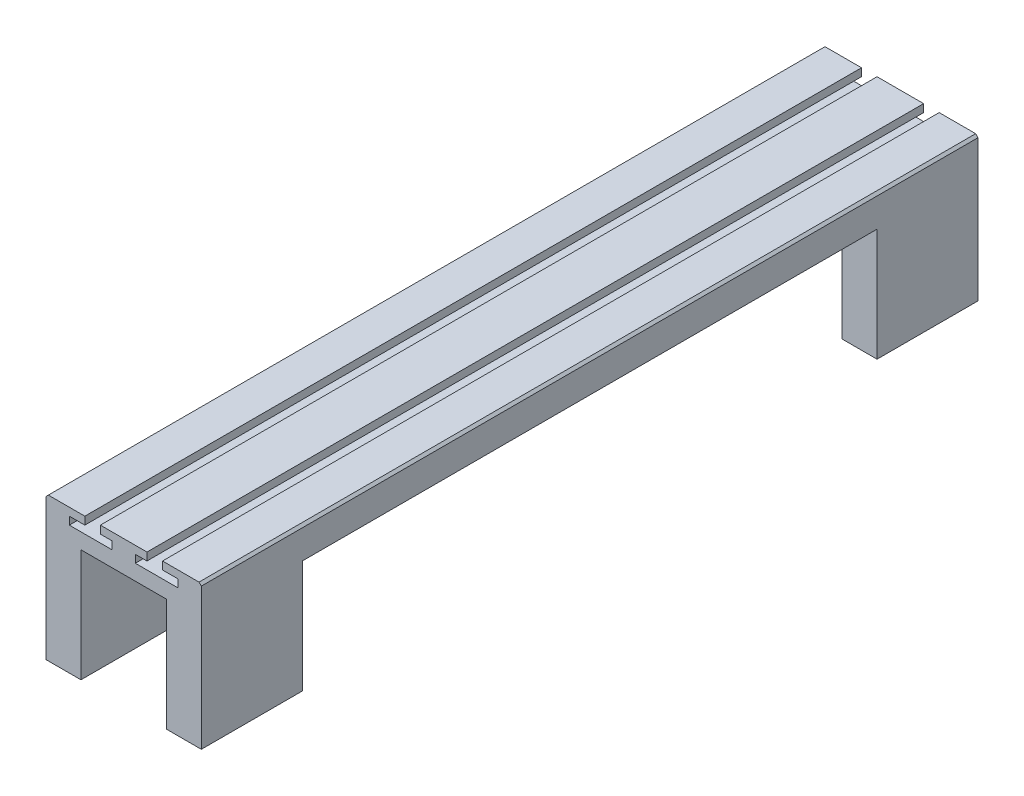
ISO-10303-21;
HEADER;
FILE_DESCRIPTION(('STEP AP214'),'2;1');
FILE_NAME('part.step','',(''),(''),'','','');
FILE_SCHEMA(('AUTOMOTIVE_DESIGN { 1 0 10303 214 1 1 1 1 }'));
ENDSEC;
DATA;
#1=APPLICATION_CONTEXT('core data for automotive mechanical design processes');
#2=APPLICATION_PROTOCOL_DEFINITION('international standard','automotive_design',2000,#1);
#3=PRODUCT_CONTEXT('',#1,'mechanical');
#4=PRODUCT('Part','Part','',(#3));
#5=PRODUCT_RELATED_PRODUCT_CATEGORY('part','',(#4));
#6=PRODUCT_DEFINITION_FORMATION('','',#4);
#7=PRODUCT_DEFINITION_CONTEXT('part definition',#1,'design');
#8=PRODUCT_DEFINITION('design','',#6,#7);
#9=PRODUCT_DEFINITION_SHAPE('','',#8);
#10=(LENGTH_UNIT() NAMED_UNIT(*) SI_UNIT(.MILLI.,.METRE.));
#11=(NAMED_UNIT(*) PLANE_ANGLE_UNIT() SI_UNIT($,.RADIAN.));
#12=(NAMED_UNIT(*) SI_UNIT($,.STERADIAN.) SOLID_ANGLE_UNIT());
#13=UNCERTAINTY_MEASURE_WITH_UNIT(LENGTH_MEASURE(1.E-05),#10,'distance_accuracy_value','');
#14=(GEOMETRIC_REPRESENTATION_CONTEXT(3) GLOBAL_UNCERTAINTY_ASSIGNED_CONTEXT((#13)) GLOBAL_UNIT_ASSIGNED_CONTEXT((#10,
#11,#12)) REPRESENTATION_CONTEXT('',''));
#15=CARTESIAN_POINT('',(0.,0.,0.));
#16=DIRECTION('',(0.,0.,1.));
#17=DIRECTION('',(1.,0.,0.));
#18=AXIS2_PLACEMENT_3D('',#15,#16,#17);
#19=CARTESIAN_POINT('',(-50.,-40.,1000.));
#20=DIRECTION('',(0.,1.,0.));
#21=DIRECTION('',(-1.,0.,0.));
#22=AXIS2_PLACEMENT_3D('',#19,#20,#21);
#23=PLANE('',#22);
#24=DIRECTION('',(-1.,0.,0.));
#25=VECTOR('',#24,1.);
#26=CARTESIAN_POINT('',(-50.,-40.,130.));
#27=LINE('',#26,#25);
#28=CARTESIAN_POINT('',(-4.99999999999998,-40.,130.));
#29=VERTEX_POINT('',#28);
#30=CARTESIAN_POINT('',(-50.,-40.,130.));
#31=VERTEX_POINT('',#30);
#32=EDGE_CURVE('E360',#29,#31,#27,.T.);
#33=ORIENTED_EDGE('',*,*,#32,.F.);
#34=DIRECTION('',(0.,0.,1.));
#35=VECTOR('',#34,1.);
#36=CARTESIAN_POINT('',(-5.,-40.,0.));
#37=LINE('',#36,#35);
#38=CARTESIAN_POINT('',(-4.99999999999998,-40.,0.));
#39=VERTEX_POINT('',#38);
#40=EDGE_CURVE('E318',#39,#29,#37,.T.);
#41=ORIENTED_EDGE('',*,*,#40,.F.);
#42=DIRECTION('',(1.,0.,0.));
#43=VECTOR('',#42,1.);
#44=CARTESIAN_POINT('',(-50.,-40.,0.));
#45=LINE('',#44,#43);
#46=CARTESIAN_POINT('',(105.,-40.,0.));
#47=VERTEX_POINT('',#46);
#48=EDGE_CURVE('E482',#39,#47,#45,.T.);
#49=ORIENTED_EDGE('',*,*,#48,.T.);
#50=DIRECTION('',(0.,0.,-1.));
#51=VECTOR('',#50,1.);
#52=CARTESIAN_POINT('',(105.,-40.,0.));
#53=LINE('',#52,#51);
#54=CARTESIAN_POINT('',(105.,-40.,130.));
#55=VERTEX_POINT('',#54);
#56=EDGE_CURVE('E327',#55,#47,#53,.T.);
#57=ORIENTED_EDGE('',*,*,#56,.F.);
#58=DIRECTION('',(-1.,0.,0.));
#59=VECTOR('',#58,1.);
#60=CARTESIAN_POINT('',(150.,-40.,130.));
#61=LINE('',#60,#59);
#62=CARTESIAN_POINT('',(150.,-40.,130.));
#63=VERTEX_POINT('',#62);
#64=EDGE_CURVE('E299',#63,#55,#61,.T.);
#65=ORIENTED_EDGE('',*,*,#64,.F.);
#66=DIRECTION('',(0.,0.,-1.));
#67=VECTOR('',#66,1.);
#68=CARTESIAN_POINT('',(150.,-40.,1000.));
#69=LINE('',#68,#67);
#70=CARTESIAN_POINT('',(150.,-40.,870.));
#71=VERTEX_POINT('',#70);
#72=EDGE_CURVE('E271',#71,#63,#69,.T.);
#73=ORIENTED_EDGE('',*,*,#72,.F.);
#74=DIRECTION('',(1.,0.,0.));
#75=VECTOR('',#74,1.);
#76=CARTESIAN_POINT('',(150.,-40.,870.));
#77=LINE('',#76,#75);
#78=CARTESIAN_POINT('',(105.,-40.,870.));
#79=VERTEX_POINT('',#78);
#80=EDGE_CURVE('E266',#79,#71,#77,.T.);
#81=ORIENTED_EDGE('',*,*,#80,.F.);
#82=DIRECTION('',(0.,0.,-1.));
#83=VECTOR('',#82,1.);
#84=CARTESIAN_POINT('',(105.,-40.,1000.));
#85=LINE('',#84,#83);
#86=CARTESIAN_POINT('',(105.,-40.,1000.));
#87=VERTEX_POINT('',#86);
#88=EDGE_CURVE('E268',#87,#79,#85,.T.);
#89=ORIENTED_EDGE('',*,*,#88,.F.);
#90=DIRECTION('',(1.,0.,0.));
#91=VECTOR('',#90,1.);
#92=CARTESIAN_POINT('',(-50.,-40.,1000.));
#93=LINE('',#92,#91);
#94=CARTESIAN_POINT('',(-4.99999999999998,-40.,1000.));
#95=VERTEX_POINT('',#94);
#96=EDGE_CURVE('E421',#95,#87,#93,.T.);
#97=ORIENTED_EDGE('',*,*,#96,.F.);
#98=DIRECTION('',(0.,0.,1.));
#99=VECTOR('',#98,1.);
#100=CARTESIAN_POINT('',(-5.,-40.,1000.));
#101=LINE('',#100,#99);
#102=CARTESIAN_POINT('',(-4.99999999999998,-40.,870.));
#103=VERTEX_POINT('',#102);
#104=EDGE_CURVE('E384',#103,#95,#101,.T.);
#105=ORIENTED_EDGE('',*,*,#104,.F.);
#106=DIRECTION('',(1.,0.,0.));
#107=VECTOR('',#106,1.);
#108=CARTESIAN_POINT('',(-50.,-40.,870.));
#109=LINE('',#108,#107);
#110=CARTESIAN_POINT('',(-50.,-40.,870.));
#111=VERTEX_POINT('',#110);
#112=EDGE_CURVE('E288',#111,#103,#109,.T.);
#113=ORIENTED_EDGE('',*,*,#112,.F.);
#114=DIRECTION('',(0.,0.,-1.));
#115=VECTOR('',#114,1.);
#116=CARTESIAN_POINT('',(-50.,-40.,1000.));
#117=LINE('',#116,#115);
#118=EDGE_CURVE('E602',#111,#31,#117,.T.);
#119=ORIENTED_EDGE('',*,*,#118,.T.);
#120=EDGE_LOOP('',(#33,#41,#49,#57,#65,#73,#81,#89,#97,#105,#113,#119));
#121=FACE_BOUND('',#120,.T.);
#122=ADVANCED_FACE('F45',(#121),#23,.F.);
#123=CARTESIAN_POINT('',(-8.54845495636354,0.,1000.));
#124=DIRECTION('',(0.,-1.,0.));
#125=DIRECTION('',(1.,0.,0.));
#126=AXIS2_PLACEMENT_3D('',#123,#124,#125);
#127=PLANE('',#126);
#128=DIRECTION('',(-1.,0.,0.));
#129=VECTOR('',#128,1.);
#130=CARTESIAN_POINT('',(-8.54845495636354,0.,0.));
#131=LINE('',#130,#129);
#132=CARTESIAN_POINT('',(0.,0.,0.));
#133=VERTEX_POINT('',#132);
#134=CARTESIAN_POINT('',(-47.,0.,0.));
#135=VERTEX_POINT('',#134);
#136=EDGE_CURVE('E412',#133,#135,#131,.T.);
#137=ORIENTED_EDGE('',*,*,#136,.T.);
#138=DIRECTION('',(0.,0.,1.));
#139=VECTOR('',#138,1.);
#140=CARTESIAN_POINT('',(-47.,0.,1000.));
#141=LINE('',#140,#139);
#142=CARTESIAN_POINT('',(-47.,0.,1000.));
#143=VERTEX_POINT('',#142);
#144=EDGE_CURVE('E615',#135,#143,#141,.T.);
#145=ORIENTED_EDGE('',*,*,#144,.T.);
#146=DIRECTION('',(-1.,0.,0.));
#147=VECTOR('',#146,1.);
#148=CARTESIAN_POINT('',(-8.54845495636354,0.,1000.));
#149=LINE('',#148,#147);
#150=CARTESIAN_POINT('',(0.,0.,1000.));
#151=VERTEX_POINT('',#150);
#152=EDGE_CURVE('E413',#151,#143,#149,.T.);
#153=ORIENTED_EDGE('',*,*,#152,.F.);
#154=DIRECTION('',(0.,0.,-1.));
#155=VECTOR('',#154,1.);
#156=CARTESIAN_POINT('',(0.,0.,1000.));
#157=LINE('',#156,#155);
#158=EDGE_CURVE('E475',#151,#133,#157,.T.);
#159=ORIENTED_EDGE('',*,*,#158,.T.);
#160=EDGE_LOOP('',(#137,#145,#153,#159));
#161=FACE_BOUND('',#160,.T.);
#162=ADVANCED_FACE('F711',(#161),#127,.F.);
#163=CARTESIAN_POINT('',(-50.,0.,1000.));
#164=DIRECTION('',(1.,0.,0.));
#165=DIRECTION('',(0.,1.,0.));
#166=AXIS2_PLACEMENT_3D('',#163,#164,#165);
#167=PLANE('',#166);
#168=DIRECTION('',(0.,-1.,0.));
#169=VECTOR('',#168,1.);
#170=CARTESIAN_POINT('',(-50.,0.,1000.));
#171=LINE('',#170,#169);
#172=CARTESIAN_POINT('',(-50.,-2.9999999999999,1000.));
#173=VERTEX_POINT('',#172);
#174=CARTESIAN_POINT('',(-50.,-185.,1000.));
#175=VERTEX_POINT('',#174);
#176=EDGE_CURVE('E417',#173,#175,#171,.T.);
#177=ORIENTED_EDGE('',*,*,#176,.F.);
#178=DIRECTION('',(0.,0.,-1.));
#179=VECTOR('',#178,1.);
#180=CARTESIAN_POINT('',(-50.,-2.9999999999999,1000.));
#181=LINE('',#180,#179);
#182=CARTESIAN_POINT('',(-50.,-2.9999999999999,0.));
#183=VERTEX_POINT('',#182);
#184=EDGE_CURVE('E605',#173,#183,#181,.T.);
#185=ORIENTED_EDGE('',*,*,#184,.T.);
#186=DIRECTION('',(0.,-1.,0.));
#187=VECTOR('',#186,1.);
#188=CARTESIAN_POINT('',(-50.,0.,0.));
#189=LINE('',#188,#187);
#190=CARTESIAN_POINT('',(-50.,-185.,0.));
#191=VERTEX_POINT('',#190);
#192=EDGE_CURVE('E479',#183,#191,#189,.T.);
#193=ORIENTED_EDGE('',*,*,#192,.T.);
#194=DIRECTION('',(0.,0.,-1.));
#195=VECTOR('',#194,1.);
#196=CARTESIAN_POINT('',(-50.,-185.,0.));
#197=LINE('',#196,#195);
#198=CARTESIAN_POINT('',(-50.,-185.,130.));
#199=VERTEX_POINT('',#198);
#200=EDGE_CURVE('E364',#199,#191,#197,.T.);
#201=ORIENTED_EDGE('',*,*,#200,.F.);
#202=DIRECTION('',(0.,1.,0.));
#203=VECTOR('',#202,1.);
#204=CARTESIAN_POINT('',(-50.,-185.,130.));
#205=LINE('',#204,#203);
#206=EDGE_CURVE('E355',#199,#31,#205,.T.);
#207=ORIENTED_EDGE('',*,*,#206,.T.);
#208=ORIENTED_EDGE('',*,*,#118,.F.);
#209=DIRECTION('',(0.,1.,0.));
#210=VECTOR('',#209,1.);
#211=CARTESIAN_POINT('',(-50.,-185.,870.));
#212=LINE('',#211,#210);
#213=CARTESIAN_POINT('',(-50.,-185.,870.));
#214=VERTEX_POINT('',#213);
#215=EDGE_CURVE('E408',#214,#111,#212,.T.);
#216=ORIENTED_EDGE('',*,*,#215,.F.);
#217=DIRECTION('',(0.,0.,-1.));
#218=VECTOR('',#217,1.);
#219=CARTESIAN_POINT('',(-50.,-185.,1000.));
#220=LINE('',#219,#218);
#221=EDGE_CURVE('E379',#175,#214,#220,.T.);
#222=ORIENTED_EDGE('',*,*,#221,.F.);
#223=EDGE_LOOP('',(#177,#185,#193,#201,#207,#208,#216,#222));
#224=FACE_BOUND('',#223,.T.);
#225=ADVANCED_FACE('F720',(#224),#167,.F.);
#226=CARTESIAN_POINT('',(150.,-40.,1000.));
#227=DIRECTION('',(-1.,0.,0.));
#228=DIRECTION('',(0.,0.,1.));
#229=AXIS2_PLACEMENT_3D('',#226,#227,#228);
#230=PLANE('',#229);
#231=DIRECTION('',(0.,1.,0.));
#232=VECTOR('',#231,1.);
#233=CARTESIAN_POINT('',(150.,-40.,0.));
#234=LINE('',#233,#232);
#235=CARTESIAN_POINT('',(150.,-185.,0.));
#236=VERTEX_POINT('',#235);
#237=CARTESIAN_POINT('',(150.,-3.,0.));
#238=VERTEX_POINT('',#237);
#239=EDGE_CURVE('E485',#236,#238,#234,.T.);
#240=ORIENTED_EDGE('',*,*,#239,.T.);
#241=DIRECTION('',(0.,0.,1.));
#242=VECTOR('',#241,1.);
#243=CARTESIAN_POINT('',(150.,-3.,1000.));
#244=LINE('',#243,#242);
#245=CARTESIAN_POINT('',(150.,-3.,1000.));
#246=VERTEX_POINT('',#245);
#247=EDGE_CURVE('E11',#238,#246,#244,.T.);
#248=ORIENTED_EDGE('',*,*,#247,.T.);
#249=DIRECTION('',(0.,1.,0.));
#250=VECTOR('',#249,1.);
#251=CARTESIAN_POINT('',(150.,-40.,1000.));
#252=LINE('',#251,#250);
#253=CARTESIAN_POINT('',(150.,-185.,1000.));
#254=VERTEX_POINT('',#253);
#255=EDGE_CURVE('E424',#254,#246,#252,.T.);
#256=ORIENTED_EDGE('',*,*,#255,.F.);
#257=DIRECTION('',(0.,0.,1.));
#258=VECTOR('',#257,1.);
#259=CARTESIAN_POINT('',(150.,-185.,1000.));
#260=LINE('',#259,#258);
#261=CARTESIAN_POINT('',(150.,-185.,870.));
#262=VERTEX_POINT('',#261);
#263=EDGE_CURVE('E297',#262,#254,#260,.T.);
#264=ORIENTED_EDGE('',*,*,#263,.F.);
#265=DIRECTION('',(0.,1.,0.));
#266=VECTOR('',#265,1.);
#267=CARTESIAN_POINT('',(150.,-185.,870.));
#268=LINE('',#267,#266);
#269=EDGE_CURVE('E293',#262,#71,#268,.T.);
#270=ORIENTED_EDGE('',*,*,#269,.T.);
#271=ORIENTED_EDGE('',*,*,#72,.T.);
#272=DIRECTION('',(0.,1.,0.));
#273=VECTOR('',#272,1.);
#274=CARTESIAN_POINT('',(150.,-185.,130.));
#275=LINE('',#274,#273);
#276=CARTESIAN_POINT('',(150.,-185.,130.));
#277=VERTEX_POINT('',#276);
#278=EDGE_CURVE('E313',#277,#63,#275,.T.);
#279=ORIENTED_EDGE('',*,*,#278,.F.);
#280=DIRECTION('',(0.,0.,1.));
#281=VECTOR('',#280,1.);
#282=CARTESIAN_POINT('',(150.,-185.,0.));
#283=LINE('',#282,#281);
#284=EDGE_CURVE('E331',#236,#277,#283,.T.);
#285=ORIENTED_EDGE('',*,*,#284,.F.);
#286=EDGE_LOOP('',(#240,#248,#256,#264,#270,#271,#279,#285));
#287=FACE_BOUND('',#286,.T.);
#288=ADVANCED_FACE('F747',(#287),#230,.F.);
#289=CARTESIAN_POINT('',(131.451545043636,0.,1000.));
#290=DIRECTION('',(0.,-1.,0.));
#291=DIRECTION('',(1.,0.,0.));
#292=AXIS2_PLACEMENT_3D('',#289,#290,#291);
#293=PLANE('',#292);
#294=DIRECTION('',(-1.,0.,0.));
#295=VECTOR('',#294,1.);
#296=CARTESIAN_POINT('',(150.,0.,1000.));
#297=LINE('',#296,#295);
#298=CARTESIAN_POINT('',(147.,0.,1000.));
#299=VERTEX_POINT('',#298);
#300=CARTESIAN_POINT('',(100.,0.,1000.));
#301=VERTEX_POINT('',#300);
#302=EDGE_CURVE('E427',#299,#301,#297,.T.);
#303=ORIENTED_EDGE('',*,*,#302,.F.);
#304=DIRECTION('',(0.,0.,-1.));
#305=VECTOR('',#304,1.);
#306=CARTESIAN_POINT('',(147.,0.,1000.));
#307=LINE('',#306,#305);
#308=CARTESIAN_POINT('',(147.,0.,0.));
#309=VERTEX_POINT('',#308);
#310=EDGE_CURVE('E55',#299,#309,#307,.T.);
#311=ORIENTED_EDGE('',*,*,#310,.T.);
#312=DIRECTION('',(-1.,0.,0.));
#313=VECTOR('',#312,1.);
#314=CARTESIAN_POINT('',(131.451545043636,0.,0.));
#315=LINE('',#314,#313);
#316=CARTESIAN_POINT('',(100.,0.,0.));
#317=VERTEX_POINT('',#316);
#318=EDGE_CURVE('E488',#309,#317,#315,.T.);
#319=ORIENTED_EDGE('',*,*,#318,.T.);
#320=DIRECTION('',(0.,0.,-1.));
#321=VECTOR('',#320,1.);
#322=CARTESIAN_POINT('',(100.,0.,1000.));
#323=LINE('',#322,#321);
#324=EDGE_CURVE('E596',#301,#317,#323,.T.);
#325=ORIENTED_EDGE('',*,*,#324,.F.);
#326=EDGE_LOOP('',(#303,#311,#319,#325));
#327=FACE_BOUND('',#326,.T.);
#328=ADVANCED_FACE('F627',(#327),#293,.F.);
#329=CARTESIAN_POINT('',(100.,0.,1000.));
#330=DIRECTION('',(1.,0.,0.));
#331=DIRECTION('',(0.,0.,-1.));
#332=AXIS2_PLACEMENT_3D('',#329,#330,#331);
#333=PLANE('',#332);
#334=DIRECTION('',(0.,-1.,0.));
#335=VECTOR('',#334,1.);
#336=CARTESIAN_POINT('',(100.,0.,0.));
#337=LINE('',#336,#335);
#338=CARTESIAN_POINT('',(100.,-10.,0.));
#339=VERTEX_POINT('',#338);
#340=EDGE_CURVE('E491',#317,#339,#337,.T.);
#341=ORIENTED_EDGE('',*,*,#340,.T.);
#342=DIRECTION('',(0.,0.,-1.));
#343=VECTOR('',#342,1.);
#344=CARTESIAN_POINT('',(100.,-10.,1000.));
#345=LINE('',#344,#343);
#346=CARTESIAN_POINT('',(100.,-10.,1000.));
#347=VERTEX_POINT('',#346);
#348=EDGE_CURVE('E592',#347,#339,#345,.T.);
#349=ORIENTED_EDGE('',*,*,#348,.F.);
#350=DIRECTION('',(0.,-1.,0.));
#351=VECTOR('',#350,1.);
#352=CARTESIAN_POINT('',(100.,0.,1000.));
#353=LINE('',#352,#351);
#354=EDGE_CURVE('E430',#301,#347,#353,.T.);
#355=ORIENTED_EDGE('',*,*,#354,.F.);
#356=ORIENTED_EDGE('',*,*,#324,.T.);
#357=EDGE_LOOP('',(#341,#349,#355,#356));
#358=FACE_BOUND('',#357,.T.);
#359=ADVANCED_FACE('F638',(#358),#333,.F.);
#360=CARTESIAN_POINT('',(100.,-10.,1000.));
#361=DIRECTION('',(0.,1.,0.));
#362=DIRECTION('',(0.,0.,1.));
#363=AXIS2_PLACEMENT_3D('',#360,#361,#362);
#364=PLANE('',#363);
#365=DIRECTION('',(1.,0.,0.));
#366=VECTOR('',#365,1.);
#367=CARTESIAN_POINT('',(100.,-10.,0.));
#368=LINE('',#367,#366);
#369=CARTESIAN_POINT('',(120.,-10.,0.));
#370=VERTEX_POINT('',#369);
#371=EDGE_CURVE('E494',#339,#370,#368,.T.);
#372=ORIENTED_EDGE('',*,*,#371,.T.);
#373=DIRECTION('',(0.,0.,-1.));
#374=VECTOR('',#373,1.);
#375=CARTESIAN_POINT('',(120.,-10.,1000.));
#376=LINE('',#375,#374);
#377=CARTESIAN_POINT('',(120.,-10.,1000.));
#378=VERTEX_POINT('',#377);
#379=EDGE_CURVE('E588',#378,#370,#376,.T.);
#380=ORIENTED_EDGE('',*,*,#379,.F.);
#381=DIRECTION('',(1.,0.,0.));
#382=VECTOR('',#381,1.);
#383=CARTESIAN_POINT('',(100.,-10.,1000.));
#384=LINE('',#383,#382);
#385=EDGE_CURVE('E433',#347,#378,#384,.T.);
#386=ORIENTED_EDGE('',*,*,#385,.F.);
#387=ORIENTED_EDGE('',*,*,#348,.T.);
#388=EDGE_LOOP('',(#372,#380,#386,#387));
#389=FACE_BOUND('',#388,.T.);
#390=ADVANCED_FACE('F642',(#389),#364,.F.);
#391=CARTESIAN_POINT('',(120.,-10.,1000.));
#392=DIRECTION('',(1.,0.,0.));
#393=DIRECTION('',(0.,0.,-1.));
#394=AXIS2_PLACEMENT_3D('',#391,#392,#393);
#395=PLANE('',#394);
#396=DIRECTION('',(0.,-1.,0.));
#397=VECTOR('',#396,1.);
#398=CARTESIAN_POINT('',(120.,-10.,0.));
#399=LINE('',#398,#397);
#400=CARTESIAN_POINT('',(120.,-20.,0.));
#401=VERTEX_POINT('',#400);
#402=EDGE_CURVE('E497',#370,#401,#399,.T.);
#403=ORIENTED_EDGE('',*,*,#402,.T.);
#404=DIRECTION('',(0.,0.,-1.));
#405=VECTOR('',#404,1.);
#406=CARTESIAN_POINT('',(120.,-20.,1000.));
#407=LINE('',#406,#405);
#408=CARTESIAN_POINT('',(120.,-20.,1000.));
#409=VERTEX_POINT('',#408);
#410=EDGE_CURVE('E584',#409,#401,#407,.T.);
#411=ORIENTED_EDGE('',*,*,#410,.F.);
#412=DIRECTION('',(0.,-1.,0.));
#413=VECTOR('',#412,1.);
#414=CARTESIAN_POINT('',(120.,-10.,1000.));
#415=LINE('',#414,#413);
#416=EDGE_CURVE('E436',#378,#409,#415,.T.);
#417=ORIENTED_EDGE('',*,*,#416,.F.);
#418=ORIENTED_EDGE('',*,*,#379,.T.);
#419=EDGE_LOOP('',(#403,#411,#417,#418));
#420=FACE_BOUND('',#419,.T.);
#421=ADVANCED_FACE('F650',(#420),#395,.F.);
#422=CARTESIAN_POINT('',(120.,-20.,1000.));
#423=DIRECTION('',(0.,-1.,0.));
#424=DIRECTION('',(1.,0.,0.));
#425=AXIS2_PLACEMENT_3D('',#422,#423,#424);
#426=PLANE('',#425);
#427=DIRECTION('',(-1.,0.,0.));
#428=VECTOR('',#427,1.);
#429=CARTESIAN_POINT('',(120.,-20.,0.));
#430=LINE('',#429,#428);
#431=CARTESIAN_POINT('',(65.,-20.,0.));
#432=VERTEX_POINT('',#431);
#433=EDGE_CURVE('E500',#401,#432,#430,.T.);
#434=ORIENTED_EDGE('',*,*,#433,.T.);
#435=DIRECTION('',(0.,0.,-1.));
#436=VECTOR('',#435,1.);
#437=CARTESIAN_POINT('',(65.,-20.,1000.));
#438=LINE('',#437,#436);
#439=CARTESIAN_POINT('',(65.,-20.,1000.));
#440=VERTEX_POINT('',#439);
#441=EDGE_CURVE('E580',#440,#432,#438,.T.);
#442=ORIENTED_EDGE('',*,*,#441,.F.);
#443=DIRECTION('',(-1.,0.,0.));
#444=VECTOR('',#443,1.);
#445=CARTESIAN_POINT('',(120.,-20.,1000.));
#446=LINE('',#445,#444);
#447=EDGE_CURVE('E439',#409,#440,#446,.T.);
#448=ORIENTED_EDGE('',*,*,#447,.F.);
#449=ORIENTED_EDGE('',*,*,#410,.T.);
#450=EDGE_LOOP('',(#434,#442,#448,#449));
#451=FACE_BOUND('',#450,.T.);
#452=ADVANCED_FACE('F653',(#451),#426,.F.);
#453=CARTESIAN_POINT('',(65.,-20.,1000.));
#454=DIRECTION('',(-1.,0.,0.));
#455=DIRECTION('',(0.,-1.,0.));
#456=AXIS2_PLACEMENT_3D('',#453,#454,#455);
#457=PLANE('',#456);
#458=DIRECTION('',(0.,1.,0.));
#459=VECTOR('',#458,1.);
#460=CARTESIAN_POINT('',(65.,-20.,0.));
#461=LINE('',#460,#459);
#462=CARTESIAN_POINT('',(65.,-10.,0.));
#463=VERTEX_POINT('',#462);
#464=EDGE_CURVE('E503',#432,#463,#461,.T.);
#465=ORIENTED_EDGE('',*,*,#464,.T.);
#466=DIRECTION('',(0.,0.,-1.));
#467=VECTOR('',#466,1.);
#468=CARTESIAN_POINT('',(65.,-10.,1000.));
#469=LINE('',#468,#467);
#470=CARTESIAN_POINT('',(65.,-10.,1000.));
#471=VERTEX_POINT('',#470);
#472=EDGE_CURVE('E576',#471,#463,#469,.T.);
#473=ORIENTED_EDGE('',*,*,#472,.F.);
#474=DIRECTION('',(0.,1.,0.));
#475=VECTOR('',#474,1.);
#476=CARTESIAN_POINT('',(65.,-20.,1000.));
#477=LINE('',#476,#475);
#478=EDGE_CURVE('E442',#440,#471,#477,.T.);
#479=ORIENTED_EDGE('',*,*,#478,.F.);
#480=ORIENTED_EDGE('',*,*,#441,.T.);
#481=EDGE_LOOP('',(#465,#473,#479,#480));
#482=FACE_BOUND('',#481,.T.);
#483=ADVANCED_FACE('F658',(#482),#457,.F.);
#484=CARTESIAN_POINT('',(80.,-10.,1000.));
#485=DIRECTION('',(0.,1.,0.));
#486=DIRECTION('',(0.,0.,1.));
#487=AXIS2_PLACEMENT_3D('',#484,#485,#486);
#488=PLANE('',#487);
#489=DIRECTION('',(1.,0.,0.));
#490=VECTOR('',#489,1.);
#491=CARTESIAN_POINT('',(80.,-10.,0.));
#492=LINE('',#491,#490);
#493=CARTESIAN_POINT('',(80.,-10.,0.));
#494=VERTEX_POINT('',#493);
#495=EDGE_CURVE('E506',#463,#494,#492,.T.);
#496=ORIENTED_EDGE('',*,*,#495,.T.);
#497=DIRECTION('',(0.,0.,-1.));
#498=VECTOR('',#497,1.);
#499=CARTESIAN_POINT('',(80.,-10.,1000.));
#500=LINE('',#499,#498);
#501=CARTESIAN_POINT('',(80.,-10.,1000.));
#502=VERTEX_POINT('',#501);
#503=EDGE_CURVE('E572',#502,#494,#500,.T.);
#504=ORIENTED_EDGE('',*,*,#503,.F.);
#505=DIRECTION('',(1.,0.,0.));
#506=VECTOR('',#505,1.);
#507=CARTESIAN_POINT('',(80.,-10.,1000.));
#508=LINE('',#507,#506);
#509=EDGE_CURVE('E445',#471,#502,#508,.T.);
#510=ORIENTED_EDGE('',*,*,#509,.F.);
#511=ORIENTED_EDGE('',*,*,#472,.T.);
#512=EDGE_LOOP('',(#496,#504,#510,#511));
#513=FACE_BOUND('',#512,.T.);
#514=ADVANCED_FACE('F664',(#513),#488,.F.);
#515=CARTESIAN_POINT('',(80.,0.,1000.));
#516=DIRECTION('',(-1.,0.,0.));
#517=DIRECTION('',(0.,0.,1.));
#518=AXIS2_PLACEMENT_3D('',#515,#516,#517);
#519=PLANE('',#518);
#520=DIRECTION('',(0.,1.,0.));
#521=VECTOR('',#520,1.);
#522=CARTESIAN_POINT('',(80.,0.,0.));
#523=LINE('',#522,#521);
#524=CARTESIAN_POINT('',(80.,0.,0.));
#525=VERTEX_POINT('',#524);
#526=EDGE_CURVE('E509',#494,#525,#523,.T.);
#527=ORIENTED_EDGE('',*,*,#526,.T.);
#528=DIRECTION('',(0.,0.,-1.));
#529=VECTOR('',#528,1.);
#530=CARTESIAN_POINT('',(80.,0.,1000.));
#531=LINE('',#530,#529);
#532=CARTESIAN_POINT('',(80.,0.,1000.));
#533=VERTEX_POINT('',#532);
#534=EDGE_CURVE('E568',#533,#525,#531,.T.);
#535=ORIENTED_EDGE('',*,*,#534,.F.);
#536=DIRECTION('',(0.,1.,0.));
#537=VECTOR('',#536,1.);
#538=CARTESIAN_POINT('',(80.,0.,1000.));
#539=LINE('',#538,#537);
#540=EDGE_CURVE('E448',#502,#533,#539,.T.);
#541=ORIENTED_EDGE('',*,*,#540,.F.);
#542=ORIENTED_EDGE('',*,*,#503,.T.);
#543=EDGE_LOOP('',(#527,#535,#541,#542));
#544=FACE_BOUND('',#543,.T.);
#545=ADVANCED_FACE('F668',(#544),#519,.F.);
#546=CARTESIAN_POINT('',(47.4286349293314,0.,1000.));
#547=DIRECTION('',(0.,-1.,0.));
#548=DIRECTION('',(1.,0.,0.));
#549=AXIS2_PLACEMENT_3D('',#546,#547,#548);
#550=PLANE('',#549);
#551=DIRECTION('',(-1.,0.,0.));
#552=VECTOR('',#551,1.);
#553=CARTESIAN_POINT('',(47.4286349293314,0.,0.));
#554=LINE('',#553,#552);
#555=CARTESIAN_POINT('',(20.,0.,0.));
#556=VERTEX_POINT('',#555);
#557=EDGE_CURVE('E513',#525,#556,#554,.T.);
#558=ORIENTED_EDGE('',*,*,#557,.T.);
#559=DIRECTION('',(0.,0.,-1.));
#560=VECTOR('',#559,1.);
#561=CARTESIAN_POINT('',(20.,0.,1000.));
#562=LINE('',#561,#560);
#563=CARTESIAN_POINT('',(20.,0.,1000.));
#564=VERTEX_POINT('',#563);
#565=EDGE_CURVE('E564',#564,#556,#562,.T.);
#566=ORIENTED_EDGE('',*,*,#565,.F.);
#567=DIRECTION('',(-1.,0.,0.));
#568=VECTOR('',#567,1.);
#569=CARTESIAN_POINT('',(77.4286349293314,0.,1000.));
#570=LINE('',#569,#568);
#571=EDGE_CURVE('E451',#533,#564,#570,.T.);
#572=ORIENTED_EDGE('',*,*,#571,.F.);
#573=ORIENTED_EDGE('',*,*,#534,.T.);
#574=EDGE_LOOP('',(#558,#566,#572,#573));
#575=FACE_BOUND('',#574,.T.);
#576=ADVANCED_FACE('F672',(#575),#550,.F.);
#577=CARTESIAN_POINT('',(20.,0.,1000.));
#578=DIRECTION('',(1.,0.,0.));
#579=DIRECTION('',(0.,0.,-1.));
#580=AXIS2_PLACEMENT_3D('',#577,#578,#579);
#581=PLANE('',#580);
#582=DIRECTION('',(0.,-1.,0.));
#583=VECTOR('',#582,1.);
#584=CARTESIAN_POINT('',(20.,0.,0.));
#585=LINE('',#584,#583);
#586=CARTESIAN_POINT('',(20.,-10.,0.));
#587=VERTEX_POINT('',#586);
#588=EDGE_CURVE('E516',#556,#587,#585,.T.);
#589=ORIENTED_EDGE('',*,*,#588,.T.);
#590=DIRECTION('',(0.,0.,-1.));
#591=VECTOR('',#590,1.);
#592=CARTESIAN_POINT('',(20.,-10.,1000.));
#593=LINE('',#592,#591);
#594=CARTESIAN_POINT('',(20.,-10.,1000.));
#595=VERTEX_POINT('',#594);
#596=EDGE_CURVE('E560',#595,#587,#593,.T.);
#597=ORIENTED_EDGE('',*,*,#596,.F.);
#598=DIRECTION('',(0.,-1.,0.));
#599=VECTOR('',#598,1.);
#600=CARTESIAN_POINT('',(20.,0.,1000.));
#601=LINE('',#600,#599);
#602=EDGE_CURVE('E454',#564,#595,#601,.T.);
#603=ORIENTED_EDGE('',*,*,#602,.F.);
#604=ORIENTED_EDGE('',*,*,#565,.T.);
#605=EDGE_LOOP('',(#589,#597,#603,#604));
#606=FACE_BOUND('',#605,.T.);
#607=ADVANCED_FACE('F678',(#606),#581,.F.);
#608=CARTESIAN_POINT('',(20.,-10.,1000.));
#609=DIRECTION('',(0.,1.,0.));
#610=DIRECTION('',(0.,0.,1.));
#611=AXIS2_PLACEMENT_3D('',#608,#609,#610);
#612=PLANE('',#611);
#613=DIRECTION('',(1.,0.,0.));
#614=VECTOR('',#613,1.);
#615=CARTESIAN_POINT('',(20.,-10.,0.));
#616=LINE('',#615,#614);
#617=CARTESIAN_POINT('',(35.,-10.,0.));
#618=VERTEX_POINT('',#617);
#619=EDGE_CURVE('E519',#587,#618,#616,.T.);
#620=ORIENTED_EDGE('',*,*,#619,.T.);
#621=DIRECTION('',(0.,0.,-1.));
#622=VECTOR('',#621,1.);
#623=CARTESIAN_POINT('',(35.,-10.,1000.));
#624=LINE('',#623,#622);
#625=CARTESIAN_POINT('',(35.,-10.,1000.));
#626=VERTEX_POINT('',#625);
#627=EDGE_CURVE('E556',#626,#618,#624,.T.);
#628=ORIENTED_EDGE('',*,*,#627,.F.);
#629=DIRECTION('',(1.,0.,0.));
#630=VECTOR('',#629,1.);
#631=CARTESIAN_POINT('',(20.,-10.,1000.));
#632=LINE('',#631,#630);
#633=EDGE_CURVE('E457',#595,#626,#632,.T.);
#634=ORIENTED_EDGE('',*,*,#633,.F.);
#635=ORIENTED_EDGE('',*,*,#596,.T.);
#636=EDGE_LOOP('',(#620,#628,#634,#635));
#637=FACE_BOUND('',#636,.T.);
#638=ADVANCED_FACE('F682',(#637),#612,.F.);
#639=CARTESIAN_POINT('',(35.,-10.,1000.));
#640=DIRECTION('',(1.,0.,0.));
#641=DIRECTION('',(0.,0.,-1.));
#642=AXIS2_PLACEMENT_3D('',#639,#640,#641);
#643=PLANE('',#642);
#644=DIRECTION('',(0.,-1.,0.));
#645=VECTOR('',#644,1.);
#646=CARTESIAN_POINT('',(35.,-10.,0.));
#647=LINE('',#646,#645);
#648=CARTESIAN_POINT('',(35.,-20.,0.));
#649=VERTEX_POINT('',#648);
#650=EDGE_CURVE('E522',#618,#649,#647,.T.);
#651=ORIENTED_EDGE('',*,*,#650,.T.);
#652=DIRECTION('',(0.,0.,-1.));
#653=VECTOR('',#652,1.);
#654=CARTESIAN_POINT('',(35.,-20.,1000.));
#655=LINE('',#654,#653);
#656=CARTESIAN_POINT('',(35.,-20.,1000.));
#657=VERTEX_POINT('',#656);
#658=EDGE_CURVE('E552',#657,#649,#655,.T.);
#659=ORIENTED_EDGE('',*,*,#658,.F.);
#660=DIRECTION('',(0.,-1.,0.));
#661=VECTOR('',#660,1.);
#662=CARTESIAN_POINT('',(35.,-10.,1000.));
#663=LINE('',#662,#661);
#664=EDGE_CURVE('E460',#626,#657,#663,.T.);
#665=ORIENTED_EDGE('',*,*,#664,.F.);
#666=ORIENTED_EDGE('',*,*,#627,.T.);
#667=EDGE_LOOP('',(#651,#659,#665,#666));
#668=FACE_BOUND('',#667,.T.);
#669=ADVANCED_FACE('F687',(#668),#643,.F.);
#670=CARTESIAN_POINT('',(35.,-20.,1000.));
#671=DIRECTION('',(0.,-1.,0.));
#672=DIRECTION('',(1.,0.,0.));
#673=AXIS2_PLACEMENT_3D('',#670,#671,#672);
#674=PLANE('',#673);
#675=DIRECTION('',(-1.,0.,0.));
#676=VECTOR('',#675,1.);
#677=CARTESIAN_POINT('',(35.,-20.,0.));
#678=LINE('',#677,#676);
#679=CARTESIAN_POINT('',(-20.,-20.,0.));
#680=VERTEX_POINT('',#679);
#681=EDGE_CURVE('E525',#649,#680,#678,.T.);
#682=ORIENTED_EDGE('',*,*,#681,.T.);
#683=DIRECTION('',(0.,0.,-1.));
#684=VECTOR('',#683,1.);
#685=CARTESIAN_POINT('',(-20.,-20.,1000.));
#686=LINE('',#685,#684);
#687=CARTESIAN_POINT('',(-20.,-20.,1000.));
#688=VERTEX_POINT('',#687);
#689=EDGE_CURVE('E548',#688,#680,#686,.T.);
#690=ORIENTED_EDGE('',*,*,#689,.F.);
#691=DIRECTION('',(-1.,0.,0.));
#692=VECTOR('',#691,1.);
#693=CARTESIAN_POINT('',(35.,-20.,1000.));
#694=LINE('',#693,#692);
#695=EDGE_CURVE('E463',#657,#688,#694,.T.);
#696=ORIENTED_EDGE('',*,*,#695,.F.);
#697=ORIENTED_EDGE('',*,*,#658,.T.);
#698=EDGE_LOOP('',(#682,#690,#696,#697));
#699=FACE_BOUND('',#698,.T.);
#700=ADVANCED_FACE('F693',(#699),#674,.F.);
#701=CARTESIAN_POINT('',(-20.,-20.,1000.));
#702=DIRECTION('',(-1.,0.,0.));
#703=DIRECTION('',(0.,-1.,0.));
#704=AXIS2_PLACEMENT_3D('',#701,#702,#703);
#705=PLANE('',#704);
#706=DIRECTION('',(0.,1.,0.));
#707=VECTOR('',#706,1.);
#708=CARTESIAN_POINT('',(-20.,-20.,0.));
#709=LINE('',#708,#707);
#710=CARTESIAN_POINT('',(-20.,-10.,0.));
#711=VERTEX_POINT('',#710);
#712=EDGE_CURVE('E528',#680,#711,#709,.T.);
#713=ORIENTED_EDGE('',*,*,#712,.T.);
#714=DIRECTION('',(0.,0.,-1.));
#715=VECTOR('',#714,1.);
#716=CARTESIAN_POINT('',(-20.,-10.,1000.));
#717=LINE('',#716,#715);
#718=CARTESIAN_POINT('',(-20.,-10.,1000.));
#719=VERTEX_POINT('',#718);
#720=EDGE_CURVE('E544',#719,#711,#717,.T.);
#721=ORIENTED_EDGE('',*,*,#720,.F.);
#722=DIRECTION('',(0.,1.,0.));
#723=VECTOR('',#722,1.);
#724=CARTESIAN_POINT('',(-20.,-20.,1000.));
#725=LINE('',#724,#723);
#726=EDGE_CURVE('E466',#688,#719,#725,.T.);
#727=ORIENTED_EDGE('',*,*,#726,.F.);
#728=ORIENTED_EDGE('',*,*,#689,.T.);
#729=EDGE_LOOP('',(#713,#721,#727,#728));
#730=FACE_BOUND('',#729,.T.);
#731=ADVANCED_FACE('F697',(#730),#705,.F.);
#732=CARTESIAN_POINT('',(0.,-10.,1000.));
#733=DIRECTION('',(0.,1.,0.));
#734=DIRECTION('',(-1.,0.,0.));
#735=AXIS2_PLACEMENT_3D('',#732,#733,#734);
#736=PLANE('',#735);
#737=DIRECTION('',(1.,0.,0.));
#738=VECTOR('',#737,1.);
#739=CARTESIAN_POINT('',(0.,-10.,0.));
#740=LINE('',#739,#738);
#741=CARTESIAN_POINT('',(0.,-10.,0.));
#742=VERTEX_POINT('',#741);
#743=EDGE_CURVE('E531',#711,#742,#740,.T.);
#744=ORIENTED_EDGE('',*,*,#743,.T.);
#745=DIRECTION('',(0.,0.,-1.));
#746=VECTOR('',#745,1.);
#747=CARTESIAN_POINT('',(0.,-10.,1000.));
#748=LINE('',#747,#746);
#749=CARTESIAN_POINT('',(0.,-10.,1000.));
#750=VERTEX_POINT('',#749);
#751=EDGE_CURVE('E540',#750,#742,#748,.T.);
#752=ORIENTED_EDGE('',*,*,#751,.F.);
#753=DIRECTION('',(1.,0.,0.));
#754=VECTOR('',#753,1.);
#755=CARTESIAN_POINT('',(0.,-10.,1000.));
#756=LINE('',#755,#754);
#757=EDGE_CURVE('E469',#719,#750,#756,.T.);
#758=ORIENTED_EDGE('',*,*,#757,.F.);
#759=ORIENTED_EDGE('',*,*,#720,.T.);
#760=EDGE_LOOP('',(#744,#752,#758,#759));
#761=FACE_BOUND('',#760,.T.);
#762=ADVANCED_FACE('F702',(#761),#736,.F.);
#763=CARTESIAN_POINT('',(0.,0.,1000.));
#764=DIRECTION('',(-1.,0.,0.));
#765=DIRECTION('',(0.,-1.,0.));
#766=AXIS2_PLACEMENT_3D('',#763,#764,#765);
#767=PLANE('',#766);
#768=DIRECTION('',(0.,1.,0.));
#769=VECTOR('',#768,1.);
#770=CARTESIAN_POINT('',(0.,0.,0.));
#771=LINE('',#770,#769);
#772=EDGE_CURVE('E418',#742,#133,#771,.T.);
#773=ORIENTED_EDGE('',*,*,#772,.T.);
#774=ORIENTED_EDGE('',*,*,#158,.F.);
#775=DIRECTION('',(0.,1.,0.));
#776=VECTOR('',#775,1.);
#777=CARTESIAN_POINT('',(0.,0.,1000.));
#778=LINE('',#777,#776);
#779=EDGE_CURVE('E472',#750,#151,#778,.T.);
#780=ORIENTED_EDGE('',*,*,#779,.F.);
#781=ORIENTED_EDGE('',*,*,#751,.T.);
#782=EDGE_LOOP('',(#773,#774,#780,#781));
#783=FACE_BOUND('',#782,.T.);
#784=ADVANCED_FACE('F708',(#783),#767,.F.);
#785=CARTESIAN_POINT('',(0.,0.,1000.));
#786=DIRECTION('',(0.,0.,-1.));
#787=DIRECTION('',(-1.,0.,0.));
#788=AXIS2_PLACEMENT_3D('',#785,#786,#787);
#789=PLANE('',#788);
#790=ORIENTED_EDGE('',*,*,#152,.T.);
#791=DIRECTION('',(0.707106781186561,0.707106781186534,0.));
#792=VECTOR('',#791,1.);
#793=CARTESIAN_POINT('',(-50.,-2.9999999999999,1000.));
#794=LINE('',#793,#792);
#795=EDGE_CURVE('E620',#143,#173,#794,.F.);
#796=ORIENTED_EDGE('',*,*,#795,.T.);
#797=ORIENTED_EDGE('',*,*,#176,.T.);
#798=DIRECTION('',(-1.,0.,0.));
#799=VECTOR('',#798,1.);
#800=CARTESIAN_POINT('',(-50.,-185.,1000.));
#801=LINE('',#800,#799);
#802=CARTESIAN_POINT('',(-4.99999999999999,-185.,1000.));
#803=VERTEX_POINT('',#802);
#804=EDGE_CURVE('E390',#803,#175,#801,.T.);
#805=ORIENTED_EDGE('',*,*,#804,.F.);
#806=DIRECTION('',(0.,1.,0.));
#807=VECTOR('',#806,1.);
#808=CARTESIAN_POINT('',(-4.99999999999999,-185.,1000.));
#809=LINE('',#808,#807);
#810=EDGE_CURVE('E394',#803,#95,#809,.T.);
#811=ORIENTED_EDGE('',*,*,#810,.T.);
#812=ORIENTED_EDGE('',*,*,#96,.T.);
#813=DIRECTION('',(0.,1.,0.));
#814=VECTOR('',#813,1.);
#815=CARTESIAN_POINT('',(105.,-185.,1000.));
#816=LINE('',#815,#814);
#817=CARTESIAN_POINT('',(105.,-185.,1000.));
#818=VERTEX_POINT('',#817);
#819=EDGE_CURVE('E286',#818,#87,#816,.T.);
#820=ORIENTED_EDGE('',*,*,#819,.F.);
#821=DIRECTION('',(-1.,0.,0.));
#822=VECTOR('',#821,1.);
#823=CARTESIAN_POINT('',(150.,-185.,1000.));
#824=LINE('',#823,#822);
#825=EDGE_CURVE('E277',#254,#818,#824,.T.);
#826=ORIENTED_EDGE('',*,*,#825,.F.);
#827=ORIENTED_EDGE('',*,*,#255,.T.);
#828=DIRECTION('',(0.707106781186547,-0.707106781186548,0.));
#829=VECTOR('',#828,1.);
#830=CARTESIAN_POINT('',(147.,0.,1000.));
#831=LINE('',#830,#829);
#832=EDGE_CURVE('E62',#246,#299,#831,.F.);
#833=ORIENTED_EDGE('',*,*,#832,.T.);
#834=ORIENTED_EDGE('',*,*,#302,.T.);
#835=ORIENTED_EDGE('',*,*,#354,.T.);
#836=ORIENTED_EDGE('',*,*,#385,.T.);
#837=ORIENTED_EDGE('',*,*,#416,.T.);
#838=ORIENTED_EDGE('',*,*,#447,.T.);
#839=ORIENTED_EDGE('',*,*,#478,.T.);
#840=ORIENTED_EDGE('',*,*,#509,.T.);
#841=ORIENTED_EDGE('',*,*,#540,.T.);
#842=ORIENTED_EDGE('',*,*,#571,.T.);
#843=ORIENTED_EDGE('',*,*,#602,.T.);
#844=ORIENTED_EDGE('',*,*,#633,.T.);
#845=ORIENTED_EDGE('',*,*,#664,.T.);
#846=ORIENTED_EDGE('',*,*,#695,.T.);
#847=ORIENTED_EDGE('',*,*,#726,.T.);
#848=ORIENTED_EDGE('',*,*,#757,.T.);
#849=ORIENTED_EDGE('',*,*,#779,.T.);
#850=EDGE_LOOP('',(#790,#796,#797,#805,#811,#812,#820,#826,#827,#833,#834,#835,#836,#837,#838,
#839,#840,#841,#842,#843,#844,#845,#846,#847,#848,#849));
#851=FACE_BOUND('',#850,.T.);
#852=ADVANCED_FACE('F645',(#851),#789,.F.);
#853=CARTESIAN_POINT('',(0.,0.,0.));
#854=DIRECTION('',(0.,0.,-1.));
#855=DIRECTION('',(-1.,0.,0.));
#856=AXIS2_PLACEMENT_3D('',#853,#854,#855);
#857=PLANE('',#856);
#858=ORIENTED_EDGE('',*,*,#192,.F.);
#859=DIRECTION('',(-0.707106781186561,-0.707106781186534,0.));
#860=VECTOR('',#859,1.);
#861=CARTESIAN_POINT('',(-23.4999999999991,23.5,0.));
#862=LINE('',#861,#860);
#863=EDGE_CURVE('E612',#183,#135,#862,.F.);
#864=ORIENTED_EDGE('',*,*,#863,.T.);
#865=ORIENTED_EDGE('',*,*,#136,.F.);
#866=ORIENTED_EDGE('',*,*,#772,.F.);
#867=ORIENTED_EDGE('',*,*,#743,.F.);
#868=ORIENTED_EDGE('',*,*,#712,.F.);
#869=ORIENTED_EDGE('',*,*,#681,.F.);
#870=ORIENTED_EDGE('',*,*,#650,.F.);
#871=ORIENTED_EDGE('',*,*,#619,.F.);
#872=ORIENTED_EDGE('',*,*,#588,.F.);
#873=ORIENTED_EDGE('',*,*,#557,.F.);
#874=ORIENTED_EDGE('',*,*,#526,.F.);
#875=ORIENTED_EDGE('',*,*,#495,.F.);
#876=ORIENTED_EDGE('',*,*,#464,.F.);
#877=ORIENTED_EDGE('',*,*,#433,.F.);
#878=ORIENTED_EDGE('',*,*,#402,.F.);
#879=ORIENTED_EDGE('',*,*,#371,.F.);
#880=ORIENTED_EDGE('',*,*,#340,.F.);
#881=ORIENTED_EDGE('',*,*,#318,.F.);
#882=DIRECTION('',(-0.707106781186547,0.707106781186548,0.));
#883=VECTOR('',#882,1.);
#884=CARTESIAN_POINT('',(73.5,73.5,0.));
#885=LINE('',#884,#883);
#886=EDGE_CURVE('E609',#309,#238,#885,.F.);
#887=ORIENTED_EDGE('',*,*,#886,.T.);
#888=ORIENTED_EDGE('',*,*,#239,.F.);
#889=DIRECTION('',(1.,0.,0.));
#890=VECTOR('',#889,1.);
#891=CARTESIAN_POINT('',(150.,-185.,0.));
#892=LINE('',#891,#890);
#893=CARTESIAN_POINT('',(105.,-185.,0.));
#894=VERTEX_POINT('',#893);
#895=EDGE_CURVE('E326',#894,#236,#892,.T.);
#896=ORIENTED_EDGE('',*,*,#895,.F.);
#897=DIRECTION('',(0.,1.,0.));
#898=VECTOR('',#897,1.);
#899=CARTESIAN_POINT('',(105.,-185.,0.));
#900=LINE('',#899,#898);
#901=EDGE_CURVE('E322',#894,#47,#900,.T.);
#902=ORIENTED_EDGE('',*,*,#901,.T.);
#903=ORIENTED_EDGE('',*,*,#48,.F.);
#904=DIRECTION('',(0.,1.,0.));
#905=VECTOR('',#904,1.);
#906=CARTESIAN_POINT('',(-4.99999999999999,-185.,0.));
#907=LINE('',#906,#905);
#908=CARTESIAN_POINT('',(-4.99999999999999,-185.,0.));
#909=VERTEX_POINT('',#908);
#910=EDGE_CURVE('E347',#909,#39,#907,.T.);
#911=ORIENTED_EDGE('',*,*,#910,.F.);
#912=DIRECTION('',(1.,0.,0.));
#913=VECTOR('',#912,1.);
#914=CARTESIAN_POINT('',(-50.,-185.,0.));
#915=LINE('',#914,#913);
#916=EDGE_CURVE('E373',#191,#909,#915,.T.);
#917=ORIENTED_EDGE('',*,*,#916,.F.);
#918=EDGE_LOOP('',(#858,#864,#865,#866,#867,#868,#869,#870,#871,#872,#873,#874,#875,#876,#877,
#878,#879,#880,#881,#887,#888,#896,#902,#903,#911,#917));
#919=FACE_BOUND('',#918,.T.);
#920=ADVANCED_FACE('F633',(#919),#857,.T.);
#921=CARTESIAN_POINT('',(-50.,-185.,870.));
#922=DIRECTION('',(0.,0.,1.));
#923=DIRECTION('',(1.,0.,0.));
#924=AXIS2_PLACEMENT_3D('',#921,#922,#923);
#925=PLANE('',#924);
#926=ORIENTED_EDGE('',*,*,#112,.T.);
#927=DIRECTION('',(0.,1.,0.));
#928=VECTOR('',#927,1.);
#929=CARTESIAN_POINT('',(-4.99999999999997,-185.,870.));
#930=LINE('',#929,#928);
#931=CARTESIAN_POINT('',(-4.99999999999997,-185.,870.));
#932=VERTEX_POINT('',#931);
#933=EDGE_CURVE('E404',#932,#103,#930,.T.);
#934=ORIENTED_EDGE('',*,*,#933,.F.);
#935=DIRECTION('',(1.,0.,0.));
#936=VECTOR('',#935,1.);
#937=CARTESIAN_POINT('',(-50.,-185.,870.));
#938=LINE('',#937,#936);
#939=EDGE_CURVE('E383',#214,#932,#938,.T.);
#940=ORIENTED_EDGE('',*,*,#939,.F.);
#941=ORIENTED_EDGE('',*,*,#215,.T.);
#942=EDGE_LOOP('',(#926,#934,#940,#941));
#943=FACE_BOUND('',#942,.T.);
#944=ADVANCED_FACE('F731',(#943),#925,.F.);
#945=CARTESIAN_POINT('',(-4.99999999999999,-185.,1000.));
#946=DIRECTION('',(-1.,0.,0.));
#947=DIRECTION('',(0.,0.,1.));
#948=AXIS2_PLACEMENT_3D('',#945,#946,#947);
#949=PLANE('',#948);
#950=ORIENTED_EDGE('',*,*,#104,.T.);
#951=ORIENTED_EDGE('',*,*,#810,.F.);
#952=DIRECTION('',(0.,0.,1.));
#953=VECTOR('',#952,1.);
#954=CARTESIAN_POINT('',(-4.99999999999999,-185.,1000.));
#955=LINE('',#954,#953);
#956=EDGE_CURVE('E387',#932,#803,#955,.T.);
#957=ORIENTED_EDGE('',*,*,#956,.F.);
#958=ORIENTED_EDGE('',*,*,#933,.T.);
#959=EDGE_LOOP('',(#950,#951,#957,#958));
#960=FACE_BOUND('',#959,.T.);
#961=ADVANCED_FACE('F729',(#960),#949,.F.);
#962=CARTESIAN_POINT('',(0.,-185.,0.));
#963=DIRECTION('',(0.,-1.,0.));
#964=DIRECTION('',(0.,0.,-1.));
#965=AXIS2_PLACEMENT_3D('',#962,#963,#964);
#966=PLANE('',#965);
#967=ORIENTED_EDGE('',*,*,#221,.T.);
#968=ORIENTED_EDGE('',*,*,#939,.T.);
#969=ORIENTED_EDGE('',*,*,#956,.T.);
#970=ORIENTED_EDGE('',*,*,#804,.T.);
#971=EDGE_LOOP('',(#967,#968,#969,#970));
#972=FACE_BOUND('',#971,.T.);
#973=ADVANCED_FACE('F724',(#972),#966,.T.);
#974=CARTESIAN_POINT('',(105.,-185.,1000.));
#975=DIRECTION('',(1.,0.,0.));
#976=DIRECTION('',(0.,1.,0.));
#977=AXIS2_PLACEMENT_3D('',#974,#975,#976);
#978=PLANE('',#977);
#979=ORIENTED_EDGE('',*,*,#88,.T.);
#980=DIRECTION('',(0.,1.,0.));
#981=VECTOR('',#980,1.);
#982=CARTESIAN_POINT('',(105.,-185.,870.));
#983=LINE('',#982,#981);
#984=CARTESIAN_POINT('',(105.,-185.,870.));
#985=VERTEX_POINT('',#984);
#986=EDGE_CURVE('E283',#985,#79,#983,.T.);
#987=ORIENTED_EDGE('',*,*,#986,.F.);
#988=DIRECTION('',(0.,0.,-1.));
#989=VECTOR('',#988,1.);
#990=CARTESIAN_POINT('',(105.,-185.,1000.));
#991=LINE('',#990,#989);
#992=EDGE_CURVE('E307',#818,#985,#991,.T.);
#993=ORIENTED_EDGE('',*,*,#992,.F.);
#994=ORIENTED_EDGE('',*,*,#819,.T.);
#995=EDGE_LOOP('',(#979,#987,#993,#994));
#996=FACE_BOUND('',#995,.T.);
#997=ADVANCED_FACE('F282',(#996),#978,.F.);
#998=CARTESIAN_POINT('',(150.,-185.,870.));
#999=DIRECTION('',(0.,0.,1.));
#1000=DIRECTION('',(1.,0.,0.));
#1001=AXIS2_PLACEMENT_3D('',#998,#999,#1000);
#1002=PLANE('',#1001);
#1003=ORIENTED_EDGE('',*,*,#80,.T.);
#1004=ORIENTED_EDGE('',*,*,#269,.F.);
#1005=DIRECTION('',(1.,0.,0.));
#1006=VECTOR('',#1005,1.);
#1007=CARTESIAN_POINT('',(150.,-185.,870.));
#1008=LINE('',#1007,#1006);
#1009=EDGE_CURVE('E291',#985,#262,#1008,.T.);
#1010=ORIENTED_EDGE('',*,*,#1009,.F.);
#1011=ORIENTED_EDGE('',*,*,#986,.T.);
#1012=EDGE_LOOP('',(#1003,#1004,#1010,#1011));
#1013=FACE_BOUND('',#1012,.T.);
#1014=ADVANCED_FACE('F290',(#1013),#1002,.F.);
#1015=CARTESIAN_POINT('',(0.,-185.,0.));
#1016=DIRECTION('',(0.,-1.,0.));
#1017=DIRECTION('',(0.,0.,-1.));
#1018=AXIS2_PLACEMENT_3D('',#1015,#1016,#1017);
#1019=PLANE('',#1018);
#1020=ORIENTED_EDGE('',*,*,#825,.T.);
#1021=ORIENTED_EDGE('',*,*,#992,.T.);
#1022=ORIENTED_EDGE('',*,*,#1009,.T.);
#1023=ORIENTED_EDGE('',*,*,#263,.T.);
#1024=EDGE_LOOP('',(#1020,#1021,#1022,#1023));
#1025=FACE_BOUND('',#1024,.T.);
#1026=ADVANCED_FACE('F774',(#1025),#1019,.T.);
#1027=CARTESIAN_POINT('',(150.,-185.,130.));
#1028=DIRECTION('',(0.,0.,-1.));
#1029=DIRECTION('',(-1.,0.,0.));
#1030=AXIS2_PLACEMENT_3D('',#1027,#1028,#1029);
#1031=PLANE('',#1030);
#1032=ORIENTED_EDGE('',*,*,#64,.T.);
#1033=DIRECTION('',(0.,1.,0.));
#1034=VECTOR('',#1033,1.);
#1035=CARTESIAN_POINT('',(105.,-185.,130.));
#1036=LINE('',#1035,#1034);
#1037=CARTESIAN_POINT('',(105.,-185.,130.));
#1038=VERTEX_POINT('',#1037);
#1039=EDGE_CURVE('E317',#1038,#55,#1036,.T.);
#1040=ORIENTED_EDGE('',*,*,#1039,.F.);
#1041=DIRECTION('',(-1.,0.,0.));
#1042=VECTOR('',#1041,1.);
#1043=CARTESIAN_POINT('',(150.,-185.,130.));
#1044=LINE('',#1043,#1042);
#1045=EDGE_CURVE('E341',#277,#1038,#1044,.T.);
#1046=ORIENTED_EDGE('',*,*,#1045,.F.);
#1047=ORIENTED_EDGE('',*,*,#278,.T.);
#1048=EDGE_LOOP('',(#1032,#1040,#1046,#1047));
#1049=FACE_BOUND('',#1048,.T.);
#1050=ADVANCED_FACE('F779',(#1049),#1031,.F.);
#1051=CARTESIAN_POINT('',(105.,-185.,0.));
#1052=DIRECTION('',(1.,0.,0.));
#1053=DIRECTION('',(0.,1.,0.));
#1054=AXIS2_PLACEMENT_3D('',#1051,#1052,#1053);
#1055=PLANE('',#1054);
#1056=ORIENTED_EDGE('',*,*,#56,.T.);
#1057=ORIENTED_EDGE('',*,*,#901,.F.);
#1058=DIRECTION('',(0.,0.,-1.));
#1059=VECTOR('',#1058,1.);
#1060=CARTESIAN_POINT('',(105.,-185.,0.));
#1061=LINE('',#1060,#1059);
#1062=EDGE_CURVE('E338',#1038,#894,#1061,.T.);
#1063=ORIENTED_EDGE('',*,*,#1062,.F.);
#1064=ORIENTED_EDGE('',*,*,#1039,.T.);
#1065=EDGE_LOOP('',(#1056,#1057,#1063,#1064));
#1066=FACE_BOUND('',#1065,.T.);
#1067=ADVANCED_FACE('F783',(#1066),#1055,.F.);
#1068=CARTESIAN_POINT('',(0.,-185.,0.));
#1069=DIRECTION('',(0.,-1.,0.));
#1070=DIRECTION('',(0.,0.,-1.));
#1071=AXIS2_PLACEMENT_3D('',#1068,#1069,#1070);
#1072=PLANE('',#1071);
#1073=ORIENTED_EDGE('',*,*,#284,.T.);
#1074=ORIENTED_EDGE('',*,*,#1045,.T.);
#1075=ORIENTED_EDGE('',*,*,#1062,.T.);
#1076=ORIENTED_EDGE('',*,*,#895,.T.);
#1077=EDGE_LOOP('',(#1073,#1074,#1075,#1076));
#1078=FACE_BOUND('',#1077,.T.);
#1079=ADVANCED_FACE('F787',(#1078),#1072,.T.);
#1080=CARTESIAN_POINT('',(-4.99999999999999,-185.,0.));
#1081=DIRECTION('',(-1.,0.,0.));
#1082=DIRECTION('',(0.,0.,1.));
#1083=AXIS2_PLACEMENT_3D('',#1080,#1081,#1082);
#1084=PLANE('',#1083);
#1085=ORIENTED_EDGE('',*,*,#40,.T.);
#1086=DIRECTION('',(0.,1.,0.));
#1087=VECTOR('',#1086,1.);
#1088=CARTESIAN_POINT('',(-4.99999999999997,-185.,130.));
#1089=LINE('',#1088,#1087);
#1090=CARTESIAN_POINT('',(-4.99999999999997,-185.,130.));
#1091=VERTEX_POINT('',#1090);
#1092=EDGE_CURVE('E351',#1091,#29,#1089,.T.);
#1093=ORIENTED_EDGE('',*,*,#1092,.F.);
#1094=DIRECTION('',(0.,0.,1.));
#1095=VECTOR('',#1094,1.);
#1096=CARTESIAN_POINT('',(-4.99999999999999,-185.,0.));
#1097=LINE('',#1096,#1095);
#1098=EDGE_CURVE('E370',#909,#1091,#1097,.T.);
#1099=ORIENTED_EDGE('',*,*,#1098,.F.);
#1100=ORIENTED_EDGE('',*,*,#910,.T.);
#1101=EDGE_LOOP('',(#1085,#1093,#1099,#1100));
#1102=FACE_BOUND('',#1101,.T.);
#1103=ADVANCED_FACE('F763',(#1102),#1084,.F.);
#1104=CARTESIAN_POINT('',(-50.,-185.,130.));
#1105=DIRECTION('',(0.,0.,-1.));
#1106=DIRECTION('',(-1.,0.,0.));
#1107=AXIS2_PLACEMENT_3D('',#1104,#1105,#1106);
#1108=PLANE('',#1107);
#1109=ORIENTED_EDGE('',*,*,#32,.T.);
#1110=ORIENTED_EDGE('',*,*,#206,.F.);
#1111=DIRECTION('',(-1.,0.,0.));
#1112=VECTOR('',#1111,1.);
#1113=CARTESIAN_POINT('',(-50.,-185.,130.));
#1114=LINE('',#1113,#1112);
#1115=EDGE_CURVE('E359',#1091,#199,#1114,.T.);
#1116=ORIENTED_EDGE('',*,*,#1115,.F.);
#1117=ORIENTED_EDGE('',*,*,#1092,.T.);
#1118=EDGE_LOOP('',(#1109,#1110,#1116,#1117));
#1119=FACE_BOUND('',#1118,.T.);
#1120=ADVANCED_FACE('F758',(#1119),#1108,.F.);
#1121=CARTESIAN_POINT('',(0.,-185.,0.));
#1122=DIRECTION('',(0.,1.,0.));
#1123=DIRECTION('',(0.,0.,1.));
#1124=AXIS2_PLACEMENT_3D('',#1121,#1122,#1123);
#1125=PLANE('',#1124);
#1126=ORIENTED_EDGE('',*,*,#200,.T.);
#1127=ORIENTED_EDGE('',*,*,#916,.T.);
#1128=ORIENTED_EDGE('',*,*,#1098,.T.);
#1129=ORIENTED_EDGE('',*,*,#1115,.T.);
#1130=EDGE_LOOP('',(#1126,#1127,#1128,#1129));
#1131=FACE_BOUND('',#1130,.T.);
#1132=ADVANCED_FACE('F754',(#1131),#1125,.F.);
#1133=CARTESIAN_POINT('',(-50.,-2.9999999999999,1000.));
#1134=DIRECTION('',(0.707106781186534,-0.707106781186561,0.));
#1135=DIRECTION('',(0.,0.,-1.));
#1136=AXIS2_PLACEMENT_3D('',#1133,#1134,#1135);
#1137=PLANE('',#1136);
#1138=ORIENTED_EDGE('',*,*,#795,.F.);
#1139=ORIENTED_EDGE('',*,*,#144,.F.);
#1140=ORIENTED_EDGE('',*,*,#863,.F.);
#1141=ORIENTED_EDGE('',*,*,#184,.F.);
#1142=EDGE_LOOP('',(#1138,#1139,#1140,#1141));
#1143=FACE_BOUND('',#1142,.T.);
#1144=ADVANCED_FACE('F714',(#1143),#1137,.F.);
#1145=CARTESIAN_POINT('',(147.,0.,1000.));
#1146=DIRECTION('',(-0.707106781186548,-0.707106781186547,0.));
#1147=DIRECTION('',(0.,0.,-1.));
#1148=AXIS2_PLACEMENT_3D('',#1145,#1146,#1147);
#1149=PLANE('',#1148);
#1150=ORIENTED_EDGE('',*,*,#832,.F.);
#1151=ORIENTED_EDGE('',*,*,#247,.F.);
#1152=ORIENTED_EDGE('',*,*,#886,.F.);
#1153=ORIENTED_EDGE('',*,*,#310,.F.);
#1154=EDGE_LOOP('',(#1150,#1151,#1152,#1153));
#1155=FACE_BOUND('',#1154,.T.);
#1156=ADVANCED_FACE('F48',(#1155),#1149,.F.);
#1157=CLOSED_SHELL('',(#122,#162,#225,#288,#328,#359,#390,#421,#452,#483,#514,#545,#576,#607,
#638,#669,#700,#731,#762,#784,#852,#920,#944,#961,#973,#997,#1014,#1026,#1050,#1067,#1079,#1103,
#1120,#1132,#1144,#1156));
#1158=MANIFOLD_SOLID_BREP('B2',#1157);
#1159=ADVANCED_BREP_SHAPE_REPRESENTATION('',(#18,#1158),#14);
#1160=SHAPE_DEFINITION_REPRESENTATION(#9,#1159);
ENDSEC;
END-ISO-10303-21;
